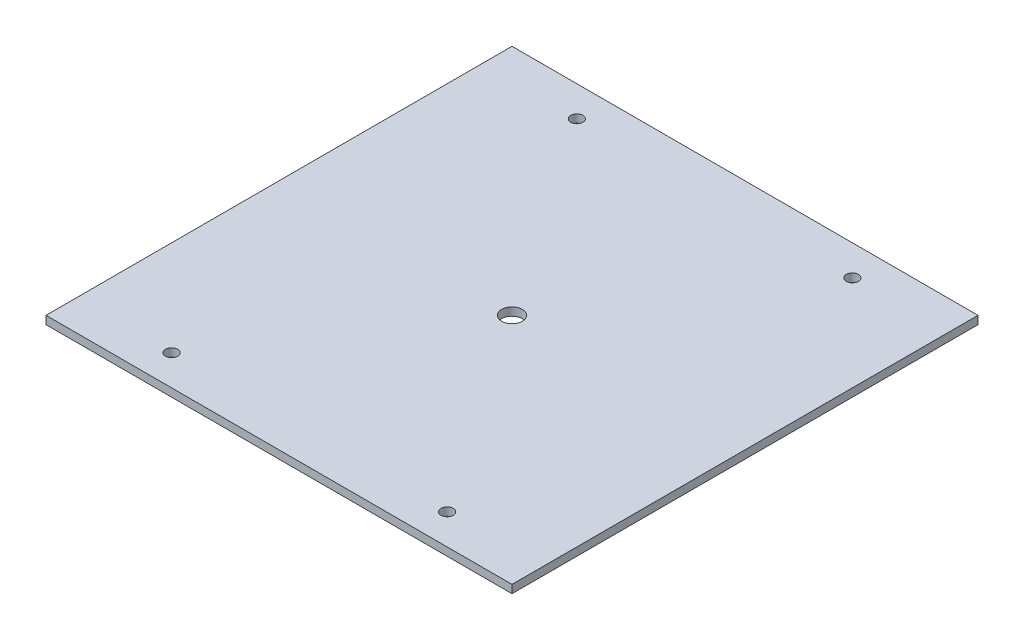
ISO-10303-21;
HEADER;
FILE_DESCRIPTION(('STEP AP214'),'2;1');
FILE_NAME('part.step','',(''),(''),'','','');
FILE_SCHEMA(('AUTOMOTIVE_DESIGN { 1 0 10303 214 1 1 1 1 }'));
ENDSEC;
DATA;
#1=APPLICATION_CONTEXT('core data for automotive mechanical design processes');
#2=APPLICATION_PROTOCOL_DEFINITION('international standard','automotive_design',2000,#1);
#3=PRODUCT_CONTEXT('',#1,'mechanical');
#4=PRODUCT('Part','Part','',(#3));
#5=PRODUCT_RELATED_PRODUCT_CATEGORY('part','',(#4));
#6=PRODUCT_DEFINITION_FORMATION('','',#4);
#7=PRODUCT_DEFINITION_CONTEXT('part definition',#1,'design');
#8=PRODUCT_DEFINITION('design','',#6,#7);
#9=PRODUCT_DEFINITION_SHAPE('','',#8);
#10=(LENGTH_UNIT() NAMED_UNIT(*) SI_UNIT(.MILLI.,.METRE.));
#11=(NAMED_UNIT(*) PLANE_ANGLE_UNIT() SI_UNIT($,.RADIAN.));
#12=(NAMED_UNIT(*) SI_UNIT($,.STERADIAN.) SOLID_ANGLE_UNIT());
#13=UNCERTAINTY_MEASURE_WITH_UNIT(LENGTH_MEASURE(1.E-05),#10,'distance_accuracy_value','');
#14=(GEOMETRIC_REPRESENTATION_CONTEXT(3) GLOBAL_UNCERTAINTY_ASSIGNED_CONTEXT((#13)) GLOBAL_UNIT_ASSIGNED_CONTEXT((#10,
#11,#12)) REPRESENTATION_CONTEXT('',''));
#15=CARTESIAN_POINT('',(0.,0.,0.));
#16=DIRECTION('',(0.,0.,1.));
#17=DIRECTION('',(1.,0.,0.));
#18=AXIS2_PLACEMENT_3D('',#15,#16,#17);
#19=CARTESIAN_POINT('',(0.,2.,0.));
#20=DIRECTION('',(0.,1.,0.));
#21=DIRECTION('',(0.,0.,1.));
#22=AXIS2_PLACEMENT_3D('',#19,#20,#21);
#23=PLANE('',#22);
#24=CARTESIAN_POINT('',(34.,2.,-50.));
#25=DIRECTION('',(0.,1.,0.));
#26=DIRECTION('',(0.,0.,1.));
#27=AXIS2_PLACEMENT_3D('',#24,#25,#26);
#28=CIRCLE('',#27,1.5);
#29=CARTESIAN_POINT('',(34.,2.,-48.5));
#30=VERTEX_POINT('',#29);
#31=EDGE_CURVE('E140',#30,#30,#28,.T.);
#32=ORIENTED_EDGE('',*,*,#31,.F.);
#33=EDGE_LOOP('',(#32));
#34=FACE_BOUND('',#33,.T.);
#35=CARTESIAN_POINT('',(34.,2.,50.));
#36=DIRECTION('',(0.,1.,0.));
#37=DIRECTION('',(0.,0.,1.));
#38=AXIS2_PLACEMENT_3D('',#35,#36,#37);
#39=CIRCLE('',#38,1.5);
#40=CARTESIAN_POINT('',(34.,2.,51.5));
#41=VERTEX_POINT('',#40);
#42=EDGE_CURVE('E134',#41,#41,#39,.T.);
#43=ORIENTED_EDGE('',*,*,#42,.F.);
#44=EDGE_LOOP('',(#43));
#45=FACE_BOUND('',#44,.T.);
#46=CARTESIAN_POINT('',(-34.,2.,50.));
#47=DIRECTION('',(0.,1.,0.));
#48=DIRECTION('',(0.,0.,1.));
#49=AXIS2_PLACEMENT_3D('',#46,#47,#48);
#50=CIRCLE('',#49,1.5);
#51=CARTESIAN_POINT('',(-34.,2.,51.5));
#52=VERTEX_POINT('',#51);
#53=EDGE_CURVE('E128',#52,#52,#50,.T.);
#54=ORIENTED_EDGE('',*,*,#53,.F.);
#55=EDGE_LOOP('',(#54));
#56=FACE_BOUND('',#55,.T.);
#57=CARTESIAN_POINT('',(-34.,2.,-50.));
#58=DIRECTION('',(0.,1.,0.));
#59=DIRECTION('',(0.,0.,1.));
#60=AXIS2_PLACEMENT_3D('',#57,#58,#59);
#61=CIRCLE('',#60,1.5);
#62=CARTESIAN_POINT('',(-34.,2.,-48.5));
#63=VERTEX_POINT('',#62);
#64=EDGE_CURVE('E122',#63,#63,#61,.T.);
#65=ORIENTED_EDGE('',*,*,#64,.F.);
#66=EDGE_LOOP('',(#65));
#67=FACE_BOUND('',#66,.T.);
#68=DIRECTION('',(0.,0.,-1.));
#69=VECTOR('',#68,1.);
#70=CARTESIAN_POINT('',(57.5,2.,-57.5));
#71=LINE('',#70,#69);
#72=CARTESIAN_POINT('',(57.5,2.,57.5));
#73=VERTEX_POINT('',#72);
#74=CARTESIAN_POINT('',(57.5,2.,-57.5));
#75=VERTEX_POINT('',#74);
#76=EDGE_CURVE('E87',#73,#75,#71,.T.);
#77=ORIENTED_EDGE('',*,*,#76,.T.);
#78=DIRECTION('',(-1.,0.,0.));
#79=VECTOR('',#78,1.);
#80=CARTESIAN_POINT('',(-57.5,2.,-57.5));
#81=LINE('',#80,#79);
#82=CARTESIAN_POINT('',(-57.5,2.,-57.5));
#83=VERTEX_POINT('',#82);
#84=EDGE_CURVE('E82',#75,#83,#81,.T.);
#85=ORIENTED_EDGE('',*,*,#84,.T.);
#86=DIRECTION('',(0.,0.,1.));
#87=VECTOR('',#86,1.);
#88=CARTESIAN_POINT('',(-57.5,2.,-57.5));
#89=LINE('',#88,#87);
#90=CARTESIAN_POINT('',(-57.5,2.,57.5));
#91=VERTEX_POINT('',#90);
#92=EDGE_CURVE('E85',#83,#91,#89,.T.);
#93=ORIENTED_EDGE('',*,*,#92,.T.);
#94=DIRECTION('',(1.,0.,0.));
#95=VECTOR('',#94,1.);
#96=CARTESIAN_POINT('',(-57.5,2.,57.5));
#97=LINE('',#96,#95);
#98=EDGE_CURVE('E52',#91,#73,#97,.T.);
#99=ORIENTED_EDGE('',*,*,#98,.T.);
#100=EDGE_LOOP('',(#77,#85,#93,#99));
#101=FACE_BOUND('',#100,.T.);
#102=CARTESIAN_POINT('',(0.,2.,0.));
#103=DIRECTION('',(0.,1.,0.));
#104=DIRECTION('',(0.,0.,1.));
#105=AXIS2_PLACEMENT_3D('',#102,#103,#104);
#106=CIRCLE('',#105,2.55);
#107=CARTESIAN_POINT('',(0.,2.,2.55));
#108=VERTEX_POINT('',#107);
#109=EDGE_CURVE('E102',#108,#108,#106,.T.);
#110=ORIENTED_EDGE('',*,*,#109,.F.);
#111=EDGE_LOOP('',(#110));
#112=FACE_BOUND('',#111,.T.);
#113=ADVANCED_FACE('F35',(#34,#45,#56,#67,#101,#112),#23,.T.);
#114=CARTESIAN_POINT('',(0.,0.,0.));
#115=DIRECTION('',(0.,1.,0.));
#116=DIRECTION('',(0.,0.,1.));
#117=AXIS2_PLACEMENT_3D('',#114,#115,#116);
#118=PLANE('',#117);
#119=CARTESIAN_POINT('',(34.,0.,-50.));
#120=DIRECTION('',(0.,1.,0.));
#121=DIRECTION('',(0.,0.,1.));
#122=AXIS2_PLACEMENT_3D('',#119,#120,#121);
#123=CIRCLE('',#122,1.5);
#124=CARTESIAN_POINT('',(34.,0.,-48.5));
#125=VERTEX_POINT('',#124);
#126=EDGE_CURVE('E137',#125,#125,#123,.T.);
#127=ORIENTED_EDGE('',*,*,#126,.T.);
#128=EDGE_LOOP('',(#127));
#129=FACE_BOUND('',#128,.T.);
#130=CARTESIAN_POINT('',(34.,0.,50.));
#131=DIRECTION('',(0.,1.,0.));
#132=DIRECTION('',(0.,0.,1.));
#133=AXIS2_PLACEMENT_3D('',#130,#131,#132);
#134=CIRCLE('',#133,1.5);
#135=CARTESIAN_POINT('',(34.,0.,51.5));
#136=VERTEX_POINT('',#135);
#137=EDGE_CURVE('E131',#136,#136,#134,.T.);
#138=ORIENTED_EDGE('',*,*,#137,.T.);
#139=EDGE_LOOP('',(#138));
#140=FACE_BOUND('',#139,.T.);
#141=CARTESIAN_POINT('',(-34.,0.,50.));
#142=DIRECTION('',(0.,1.,0.));
#143=DIRECTION('',(0.,0.,1.));
#144=AXIS2_PLACEMENT_3D('',#141,#142,#143);
#145=CIRCLE('',#144,1.5);
#146=CARTESIAN_POINT('',(-34.,0.,51.5));
#147=VERTEX_POINT('',#146);
#148=EDGE_CURVE('E125',#147,#147,#145,.T.);
#149=ORIENTED_EDGE('',*,*,#148,.T.);
#150=EDGE_LOOP('',(#149));
#151=FACE_BOUND('',#150,.T.);
#152=CARTESIAN_POINT('',(-34.,0.,-50.));
#153=DIRECTION('',(0.,1.,0.));
#154=DIRECTION('',(0.,0.,1.));
#155=AXIS2_PLACEMENT_3D('',#152,#153,#154);
#156=CIRCLE('',#155,1.5);
#157=CARTESIAN_POINT('',(-34.,0.,-48.5));
#158=VERTEX_POINT('',#157);
#159=EDGE_CURVE('E117',#158,#158,#156,.T.);
#160=ORIENTED_EDGE('',*,*,#159,.T.);
#161=EDGE_LOOP('',(#160));
#162=FACE_BOUND('',#161,.T.);
#163=DIRECTION('',(0.,0.,-1.));
#164=VECTOR('',#163,1.);
#165=CARTESIAN_POINT('',(57.5,0.,-57.5));
#166=LINE('',#165,#164);
#167=CARTESIAN_POINT('',(57.5,0.,57.5));
#168=VERTEX_POINT('',#167);
#169=CARTESIAN_POINT('',(57.5,0.,-57.5));
#170=VERTEX_POINT('',#169);
#171=EDGE_CURVE('E99',#168,#170,#166,.T.);
#172=ORIENTED_EDGE('',*,*,#171,.F.);
#173=DIRECTION('',(1.,0.,0.));
#174=VECTOR('',#173,1.);
#175=CARTESIAN_POINT('',(-57.5,0.,57.5));
#176=LINE('',#175,#174);
#177=CARTESIAN_POINT('',(-57.5,0.,57.5));
#178=VERTEX_POINT('',#177);
#179=EDGE_CURVE('E75',#178,#168,#176,.T.);
#180=ORIENTED_EDGE('',*,*,#179,.F.);
#181=DIRECTION('',(0.,0.,1.));
#182=VECTOR('',#181,1.);
#183=CARTESIAN_POINT('',(-57.5,0.,-57.5));
#184=LINE('',#183,#182);
#185=CARTESIAN_POINT('',(-57.5,0.,-57.5));
#186=VERTEX_POINT('',#185);
#187=EDGE_CURVE('E69',#186,#178,#184,.T.);
#188=ORIENTED_EDGE('',*,*,#187,.F.);
#189=DIRECTION('',(-1.,0.,0.));
#190=VECTOR('',#189,1.);
#191=CARTESIAN_POINT('',(-57.5,0.,-57.5));
#192=LINE('',#191,#190);
#193=EDGE_CURVE('E91',#170,#186,#192,.T.);
#194=ORIENTED_EDGE('',*,*,#193,.F.);
#195=EDGE_LOOP('',(#172,#180,#188,#194));
#196=FACE_BOUND('',#195,.T.);
#197=CARTESIAN_POINT('',(0.,0.,0.));
#198=DIRECTION('',(0.,1.,0.));
#199=DIRECTION('',(0.,0.,1.));
#200=AXIS2_PLACEMENT_3D('',#197,#198,#199);
#201=CIRCLE('',#200,2.55);
#202=CARTESIAN_POINT('',(0.,0.,2.55));
#203=VERTEX_POINT('',#202);
#204=EDGE_CURVE('E114',#203,#203,#201,.T.);
#205=ORIENTED_EDGE('',*,*,#204,.T.);
#206=EDGE_LOOP('',(#205));
#207=FACE_BOUND('',#206,.T.);
#208=ADVANCED_FACE('F110',(#129,#140,#151,#162,#196,#207),#118,.F.);
#209=CARTESIAN_POINT('',(57.5,2.,-57.5));
#210=DIRECTION('',(-1.,0.,0.));
#211=DIRECTION('',(0.,0.,1.));
#212=AXIS2_PLACEMENT_3D('',#209,#210,#211);
#213=PLANE('',#212);
#214=ORIENTED_EDGE('',*,*,#171,.T.);
#215=DIRECTION('',(0.,-1.,0.));
#216=VECTOR('',#215,1.);
#217=CARTESIAN_POINT('',(57.5,2.,-57.5));
#218=LINE('',#217,#216);
#219=EDGE_CURVE('E11',#75,#170,#218,.T.);
#220=ORIENTED_EDGE('',*,*,#219,.F.);
#221=ORIENTED_EDGE('',*,*,#76,.F.);
#222=DIRECTION('',(0.,-1.,0.));
#223=VECTOR('',#222,1.);
#224=CARTESIAN_POINT('',(57.5,2.,57.5));
#225=LINE('',#224,#223);
#226=EDGE_CURVE('E95',#73,#168,#225,.T.);
#227=ORIENTED_EDGE('',*,*,#226,.T.);
#228=EDGE_LOOP('',(#214,#220,#221,#227));
#229=FACE_BOUND('',#228,.T.);
#230=ADVANCED_FACE('F37',(#229),#213,.F.);
#231=CARTESIAN_POINT('',(-57.5,2.,-57.5));
#232=DIRECTION('',(0.,0.,1.));
#233=DIRECTION('',(1.,0.,0.));
#234=AXIS2_PLACEMENT_3D('',#231,#232,#233);
#235=PLANE('',#234);
#236=ORIENTED_EDGE('',*,*,#193,.T.);
#237=DIRECTION('',(0.,-1.,0.));
#238=VECTOR('',#237,1.);
#239=CARTESIAN_POINT('',(-57.5,2.,-57.5));
#240=LINE('',#239,#238);
#241=EDGE_CURVE('E44',#83,#186,#240,.T.);
#242=ORIENTED_EDGE('',*,*,#241,.F.);
#243=ORIENTED_EDGE('',*,*,#84,.F.);
#244=ORIENTED_EDGE('',*,*,#219,.T.);
#245=EDGE_LOOP('',(#236,#242,#243,#244));
#246=FACE_BOUND('',#245,.T.);
#247=ADVANCED_FACE('F90',(#246),#235,.F.);
#248=CARTESIAN_POINT('',(-57.5,2.,-57.5));
#249=DIRECTION('',(1.,0.,0.));
#250=DIRECTION('',(0.,0.,-1.));
#251=AXIS2_PLACEMENT_3D('',#248,#249,#250);
#252=PLANE('',#251);
#253=ORIENTED_EDGE('',*,*,#187,.T.);
#254=DIRECTION('',(0.,-1.,0.));
#255=VECTOR('',#254,1.);
#256=CARTESIAN_POINT('',(-57.5,2.,57.5));
#257=LINE('',#256,#255);
#258=EDGE_CURVE('E92',#91,#178,#257,.T.);
#259=ORIENTED_EDGE('',*,*,#258,.F.);
#260=ORIENTED_EDGE('',*,*,#92,.F.);
#261=ORIENTED_EDGE('',*,*,#241,.T.);
#262=EDGE_LOOP('',(#253,#259,#260,#261));
#263=FACE_BOUND('',#262,.T.);
#264=ADVANCED_FACE('F93',(#263),#252,.F.);
#265=CARTESIAN_POINT('',(-57.5,2.,57.5));
#266=DIRECTION('',(0.,0.,-1.));
#267=DIRECTION('',(-1.,0.,0.));
#268=AXIS2_PLACEMENT_3D('',#265,#266,#267);
#269=PLANE('',#268);
#270=ORIENTED_EDGE('',*,*,#179,.T.);
#271=ORIENTED_EDGE('',*,*,#226,.F.);
#272=ORIENTED_EDGE('',*,*,#98,.F.);
#273=ORIENTED_EDGE('',*,*,#258,.T.);
#274=EDGE_LOOP('',(#270,#271,#272,#273));
#275=FACE_BOUND('',#274,.T.);
#276=ADVANCED_FACE('F107',(#275),#269,.F.);
#277=CARTESIAN_POINT('',(0.,2.,0.));
#278=DIRECTION('',(0.,-1.,0.));
#279=DIRECTION('',(0.,0.,-1.));
#280=AXIS2_PLACEMENT_3D('',#277,#278,#279);
#281=CYLINDRICAL_SURFACE('',#280,2.55);
#282=ORIENTED_EDGE('',*,*,#109,.T.);
#283=EDGE_LOOP('',(#282));
#284=FACE_BOUND('',#283,.T.);
#285=ORIENTED_EDGE('',*,*,#204,.F.);
#286=EDGE_LOOP('',(#285));
#287=FACE_BOUND('',#286,.T.);
#288=ADVANCED_FACE('F158',(#284,#287),#281,.F.);
#289=CARTESIAN_POINT('',(-34.,2.,-50.));
#290=DIRECTION('',(0.,1.,0.));
#291=DIRECTION('',(0.,0.,1.));
#292=AXIS2_PLACEMENT_3D('',#289,#290,#291);
#293=CYLINDRICAL_SURFACE('',#292,1.5);
#294=ORIENTED_EDGE('',*,*,#159,.F.);
#295=EDGE_LOOP('',(#294));
#296=FACE_BOUND('',#295,.T.);
#297=ORIENTED_EDGE('',*,*,#64,.T.);
#298=EDGE_LOOP('',(#297));
#299=FACE_BOUND('',#298,.T.);
#300=ADVANCED_FACE('F155',(#296,#299),#293,.F.);
#301=CARTESIAN_POINT('',(-34.,2.,50.));
#302=DIRECTION('',(0.,1.,0.));
#303=DIRECTION('',(0.,0.,1.));
#304=AXIS2_PLACEMENT_3D('',#301,#302,#303);
#305=CYLINDRICAL_SURFACE('',#304,1.5);
#306=ORIENTED_EDGE('',*,*,#148,.F.);
#307=EDGE_LOOP('',(#306));
#308=FACE_BOUND('',#307,.T.);
#309=ORIENTED_EDGE('',*,*,#53,.T.);
#310=EDGE_LOOP('',(#309));
#311=FACE_BOUND('',#310,.T.);
#312=ADVANCED_FACE('F157',(#308,#311),#305,.F.);
#313=CARTESIAN_POINT('',(34.,2.,50.));
#314=DIRECTION('',(0.,1.,0.));
#315=DIRECTION('',(0.,0.,1.));
#316=AXIS2_PLACEMENT_3D('',#313,#314,#315);
#317=CYLINDRICAL_SURFACE('',#316,1.5);
#318=ORIENTED_EDGE('',*,*,#137,.F.);
#319=EDGE_LOOP('',(#318));
#320=FACE_BOUND('',#319,.T.);
#321=ORIENTED_EDGE('',*,*,#42,.T.);
#322=EDGE_LOOP('',(#321));
#323=FACE_BOUND('',#322,.T.);
#324=ADVANCED_FACE('F165',(#320,#323),#317,.F.);
#325=CARTESIAN_POINT('',(34.,2.,-50.));
#326=DIRECTION('',(0.,1.,0.));
#327=DIRECTION('',(0.,0.,1.));
#328=AXIS2_PLACEMENT_3D('',#325,#326,#327);
#329=CYLINDRICAL_SURFACE('',#328,1.5);
#330=ORIENTED_EDGE('',*,*,#126,.F.);
#331=EDGE_LOOP('',(#330));
#332=FACE_BOUND('',#331,.T.);
#333=ORIENTED_EDGE('',*,*,#31,.T.);
#334=EDGE_LOOP('',(#333));
#335=FACE_BOUND('',#334,.T.);
#336=ADVANCED_FACE('F144',(#332,#335),#329,.F.);
#337=CLOSED_SHELL('',(#113,#208,#230,#247,#264,#276,#288,#300,#312,#324,#336));
#338=MANIFOLD_SOLID_BREP('B2',#337);
#339=ADVANCED_BREP_SHAPE_REPRESENTATION('',(#18,#338),#14);
#340=SHAPE_DEFINITION_REPRESENTATION(#9,#339);
ENDSEC;
END-ISO-10303-21;
